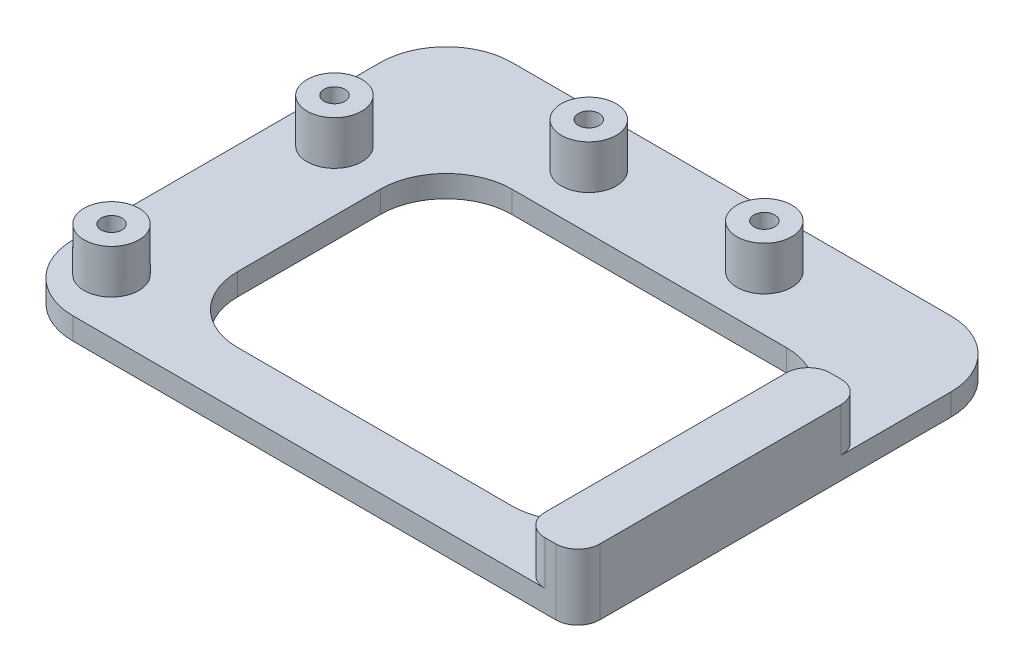
ISO-10303-21;
HEADER;
FILE_DESCRIPTION(('STEP AP214'),'2;1');
FILE_NAME('part.step','',(''),(''),'','','');
FILE_SCHEMA(('AUTOMOTIVE_DESIGN { 1 0 10303 214 1 1 1 1 }'));
ENDSEC;
DATA;
#1=APPLICATION_CONTEXT('core data for automotive mechanical design processes');
#2=APPLICATION_PROTOCOL_DEFINITION('international standard','automotive_design',2000,#1);
#3=PRODUCT_CONTEXT('',#1,'mechanical');
#4=PRODUCT('Part','Part','',(#3));
#5=PRODUCT_RELATED_PRODUCT_CATEGORY('part','',(#4));
#6=PRODUCT_DEFINITION_FORMATION('','',#4);
#7=PRODUCT_DEFINITION_CONTEXT('part definition',#1,'design');
#8=PRODUCT_DEFINITION('design','',#6,#7);
#9=PRODUCT_DEFINITION_SHAPE('','',#8);
#10=(LENGTH_UNIT() NAMED_UNIT(*) SI_UNIT(.MILLI.,.METRE.));
#11=(NAMED_UNIT(*) PLANE_ANGLE_UNIT() SI_UNIT($,.RADIAN.));
#12=(NAMED_UNIT(*) SI_UNIT($,.STERADIAN.) SOLID_ANGLE_UNIT());
#13=UNCERTAINTY_MEASURE_WITH_UNIT(LENGTH_MEASURE(1.E-05),#10,'distance_accuracy_value','');
#14=(GEOMETRIC_REPRESENTATION_CONTEXT(3) GLOBAL_UNCERTAINTY_ASSIGNED_CONTEXT((#13)) GLOBAL_UNIT_ASSIGNED_CONTEXT((#10,
#11,#12)) REPRESENTATION_CONTEXT('',''));
#15=CARTESIAN_POINT('',(0.,0.,0.));
#16=DIRECTION('',(0.,0.,1.));
#17=DIRECTION('',(1.,0.,0.));
#18=AXIS2_PLACEMENT_3D('',#15,#16,#17);
#19=CARTESIAN_POINT('',(0.,2.,0.));
#20=DIRECTION('',(0.,-1.,0.));
#21=DIRECTION('',(0.,0.,-1.));
#22=AXIS2_PLACEMENT_3D('',#19,#20,#21);
#23=PLANE('',#22);
#24=CARTESIAN_POINT('',(-8.,2.,-15.));
#25=DIRECTION('',(0.,-1.,0.));
#26=DIRECTION('',(0.,0.,-1.));
#27=AXIS2_PLACEMENT_3D('',#24,#25,#26);
#28=CIRCLE('',#27,2.5);
#29=CARTESIAN_POINT('',(-8.,2.,-17.5));
#30=VERTEX_POINT('',#29);
#31=EDGE_CURVE('E249',#30,#30,#28,.F.);
#32=ORIENTED_EDGE('',*,*,#31,.F.);
#33=EDGE_LOOP('',(#32));
#34=FACE_BOUND('',#33,.T.);
#35=CARTESIAN_POINT('',(-21.5,2.,15.));
#36=DIRECTION('',(0.,-1.,0.));
#37=DIRECTION('',(0.,0.,-1.));
#38=AXIS2_PLACEMENT_3D('',#35,#36,#37);
#39=CIRCLE('',#38,2.5);
#40=CARTESIAN_POINT('',(-21.5,2.,12.5));
#41=VERTEX_POINT('',#40);
#42=EDGE_CURVE('E241',#41,#41,#39,.F.);
#43=ORIENTED_EDGE('',*,*,#42,.F.);
#44=EDGE_LOOP('',(#43));
#45=FACE_BOUND('',#44,.T.);
#46=CARTESIAN_POINT('',(-21.5,2.,-5.31999999999998));
#47=DIRECTION('',(0.,-1.,0.));
#48=DIRECTION('',(0.,0.,-1.));
#49=AXIS2_PLACEMENT_3D('',#46,#47,#48);
#50=CIRCLE('',#49,2.5);
#51=CARTESIAN_POINT('',(-21.5,2.,-7.81999999999998));
#52=VERTEX_POINT('',#51);
#53=EDGE_CURVE('E237',#52,#52,#50,.F.);
#54=ORIENTED_EDGE('',*,*,#53,.F.);
#55=EDGE_LOOP('',(#54));
#56=FACE_BOUND('',#55,.T.);
#57=CARTESIAN_POINT('',(8.,2.,-15.));
#58=DIRECTION('',(0.,-1.,0.));
#59=DIRECTION('',(0.,0.,-1.));
#60=AXIS2_PLACEMENT_3D('',#57,#58,#59);
#61=CIRCLE('',#60,2.5);
#62=CARTESIAN_POINT('',(8.,2.,-17.5));
#63=VERTEX_POINT('',#62);
#64=EDGE_CURVE('E245',#63,#63,#61,.F.);
#65=ORIENTED_EDGE('',*,*,#64,.F.);
#66=EDGE_LOOP('',(#65));
#67=FACE_BOUND('',#66,.T.);
#68=DIRECTION('',(0.,0.,1.));
#69=VECTOR('',#68,1.);
#70=CARTESIAN_POINT('',(-26.,2.,20.));
#71=LINE('',#70,#69);
#72=CARTESIAN_POINT('',(-26.,2.,-14.));
#73=VERTEX_POINT('',#72);
#74=CARTESIAN_POINT('',(-26.,2.,14.));
#75=VERTEX_POINT('',#74);
#76=EDGE_CURVE('E494',#73,#75,#71,.T.);
#77=ORIENTED_EDGE('',*,*,#76,.T.);
#78=CARTESIAN_POINT('',(-20.,2.,14.));
#79=DIRECTION('',(0.,-1.,0.));
#80=DIRECTION('',(0.,0.,-1.));
#81=AXIS2_PLACEMENT_3D('',#78,#79,#80);
#82=CIRCLE('',#81,6.);
#83=CARTESIAN_POINT('',(-20.,2.,20.));
#84=VERTEX_POINT('',#83);
#85=EDGE_CURVE('E335',#75,#84,#82,.F.);
#86=ORIENTED_EDGE('',*,*,#85,.T.);
#87=DIRECTION('',(1.,0.,0.));
#88=VECTOR('',#87,1.);
#89=CARTESIAN_POINT('',(-26.,2.,20.));
#90=LINE('',#89,#88);
#91=CARTESIAN_POINT('',(23.,2.,20.));
#92=VERTEX_POINT('',#91);
#93=EDGE_CURVE('E227',#84,#92,#90,.T.);
#94=ORIENTED_EDGE('',*,*,#93,.T.);
#95=CARTESIAN_POINT('',(23.,2.,18.));
#96=DIRECTION('',(0.,-1.,0.));
#97=DIRECTION('',(0.,0.,-1.));
#98=AXIS2_PLACEMENT_3D('',#95,#96,#97);
#99=CIRCLE('',#98,2.);
#100=CARTESIAN_POINT('',(21.,2.,18.));
#101=VERTEX_POINT('',#100);
#102=EDGE_CURVE('E286',#92,#101,#99,.T.);
#103=ORIENTED_EDGE('',*,*,#102,.T.);
#104=DIRECTION('',(0.,0.,1.));
#105=VECTOR('',#104,1.);
#106=CARTESIAN_POINT('',(21.,2.,20.));
#107=LINE('',#106,#105);
#108=CARTESIAN_POINT('',(21.,2.,9.));
#109=VERTEX_POINT('',#108);
#110=EDGE_CURVE('E414',#109,#101,#107,.T.);
#111=ORIENTED_EDGE('',*,*,#110,.F.);
#112=CARTESIAN_POINT('',(15.,2.,9.));
#113=DIRECTION('',(0.,-1.,0.));
#114=DIRECTION('',(0.,0.,-1.));
#115=AXIS2_PLACEMENT_3D('',#112,#113,#114);
#116=CIRCLE('',#115,6.);
#117=CARTESIAN_POINT('',(15.,2.,15.));
#118=VERTEX_POINT('',#117);
#119=EDGE_CURVE('E361',#109,#118,#116,.T.);
#120=ORIENTED_EDGE('',*,*,#119,.T.);
#121=DIRECTION('',(1.,0.,0.));
#122=VECTOR('',#121,1.);
#123=CARTESIAN_POINT('',(21.,2.,15.));
#124=LINE('',#123,#122);
#125=CARTESIAN_POINT('',(-10.,2.,15.));
#126=VERTEX_POINT('',#125);
#127=EDGE_CURVE('E423',#126,#118,#124,.T.);
#128=ORIENTED_EDGE('',*,*,#127,.F.);
#129=CARTESIAN_POINT('',(-10.,2.,9.00000000000001));
#130=DIRECTION('',(0.,-1.,0.));
#131=DIRECTION('',(0.,0.,-1.));
#132=AXIS2_PLACEMENT_3D('',#129,#130,#131);
#133=CIRCLE('',#132,6.);
#134=CARTESIAN_POINT('',(-16.,2.,9.00000000000001));
#135=VERTEX_POINT('',#134);
#136=EDGE_CURVE('E55',#126,#135,#133,.T.);
#137=ORIENTED_EDGE('',*,*,#136,.T.);
#138=DIRECTION('',(0.,0.,1.));
#139=VECTOR('',#138,1.);
#140=CARTESIAN_POINT('',(-16.,2.,-10.));
#141=LINE('',#140,#139);
#142=CARTESIAN_POINT('',(-16.,2.,-4.));
#143=VERTEX_POINT('',#142);
#144=EDGE_CURVE('E420',#143,#135,#141,.T.);
#145=ORIENTED_EDGE('',*,*,#144,.F.);
#146=CARTESIAN_POINT('',(-10.,2.,-4.));
#147=DIRECTION('',(0.,-1.,0.));
#148=DIRECTION('',(0.,0.,-1.));
#149=AXIS2_PLACEMENT_3D('',#146,#147,#148);
#150=CIRCLE('',#149,6.);
#151=CARTESIAN_POINT('',(-10.,2.,-10.));
#152=VERTEX_POINT('',#151);
#153=EDGE_CURVE('E63',#143,#152,#150,.T.);
#154=ORIENTED_EDGE('',*,*,#153,.T.);
#155=DIRECTION('',(-1.,0.,0.));
#156=VECTOR('',#155,1.);
#157=CARTESIAN_POINT('',(21.,2.,-10.));
#158=LINE('',#157,#156);
#159=CARTESIAN_POINT('',(15.,2.,-10.));
#160=VERTEX_POINT('',#159);
#161=EDGE_CURVE('E383',#160,#152,#158,.T.);
#162=ORIENTED_EDGE('',*,*,#161,.F.);
#163=CARTESIAN_POINT('',(15.,2.,-4.));
#164=DIRECTION('',(0.,-1.,0.));
#165=DIRECTION('',(0.,0.,-1.));
#166=AXIS2_PLACEMENT_3D('',#163,#164,#165);
#167=CIRCLE('',#166,6.);
#168=CARTESIAN_POINT('',(21.,2.,-4.));
#169=VERTEX_POINT('',#168);
#170=EDGE_CURVE('E48',#160,#169,#167,.T.);
#171=ORIENTED_EDGE('',*,*,#170,.T.);
#172=CARTESIAN_POINT('',(23.,2.,-4.));
#173=DIRECTION('',(0.,-1.,0.));
#174=DIRECTION('',(0.,0.,-1.));
#175=AXIS2_PLACEMENT_3D('',#172,#173,#174);
#176=CIRCLE('',#175,2.);
#177=CARTESIAN_POINT('',(23.,2.,-6.));
#178=VERTEX_POINT('',#177);
#179=EDGE_CURVE('E293',#169,#178,#176,.T.);
#180=ORIENTED_EDGE('',*,*,#179,.T.);
#181=DIRECTION('',(-1.,0.,0.));
#182=VECTOR('',#181,1.);
#183=CARTESIAN_POINT('',(26.,2.,-6.));
#184=LINE('',#183,#182);
#185=CARTESIAN_POINT('',(24.,2.,-6.));
#186=VERTEX_POINT('',#185);
#187=EDGE_CURVE('E410',#186,#178,#184,.T.);
#188=ORIENTED_EDGE('',*,*,#187,.F.);
#189=CARTESIAN_POINT('',(24.,2.,-4.));
#190=DIRECTION('',(0.,-1.,0.));
#191=DIRECTION('',(0.,0.,-1.));
#192=AXIS2_PLACEMENT_3D('',#189,#190,#191);
#193=CIRCLE('',#192,2.);
#194=CARTESIAN_POINT('',(26.,2.,-4.));
#195=VERTEX_POINT('',#194);
#196=EDGE_CURVE('E289',#186,#195,#193,.T.);
#197=ORIENTED_EDGE('',*,*,#196,.T.);
#198=DIRECTION('',(0.,0.,-1.));
#199=VECTOR('',#198,1.);
#200=CARTESIAN_POINT('',(26.,2.,20.));
#201=LINE('',#200,#199);
#202=CARTESIAN_POINT('',(26.,2.,-14.));
#203=VERTEX_POINT('',#202);
#204=EDGE_CURVE('E236',#195,#203,#201,.T.);
#205=ORIENTED_EDGE('',*,*,#204,.T.);
#206=CARTESIAN_POINT('',(20.,2.,-14.));
#207=DIRECTION('',(0.,-1.,0.));
#208=DIRECTION('',(0.,0.,-1.));
#209=AXIS2_PLACEMENT_3D('',#206,#207,#208);
#210=CIRCLE('',#209,6.);
#211=CARTESIAN_POINT('',(20.,2.,-20.));
#212=VERTEX_POINT('',#211);
#213=EDGE_CURVE('E329',#203,#212,#210,.F.);
#214=ORIENTED_EDGE('',*,*,#213,.T.);
#215=DIRECTION('',(-1.,0.,0.));
#216=VECTOR('',#215,1.);
#217=CARTESIAN_POINT('',(-26.,2.,-20.));
#218=LINE('',#217,#216);
#219=CARTESIAN_POINT('',(-20.,2.,-20.));
#220=VERTEX_POINT('',#219);
#221=EDGE_CURVE('E491',#212,#220,#218,.T.);
#222=ORIENTED_EDGE('',*,*,#221,.T.);
#223=CARTESIAN_POINT('',(-20.,2.,-14.));
#224=DIRECTION('',(0.,-1.,0.));
#225=DIRECTION('',(0.,0.,-1.));
#226=AXIS2_PLACEMENT_3D('',#223,#224,#225);
#227=CIRCLE('',#226,6.);
#228=EDGE_CURVE('E332',#220,#73,#227,.F.);
#229=ORIENTED_EDGE('',*,*,#228,.T.);
#230=EDGE_LOOP('',(#77,#86,#94,#103,#111,#120,#128,#137,#145,#154,#162,#171,#180,#188,#197,#205,
#214,#222,#229));
#231=FACE_BOUND('',#230,.T.);
#232=ADVANCED_FACE('F39',(#34,#45,#56,#67,#231),#23,.F.);
#233=CARTESIAN_POINT('',(26.,2.,20.));
#234=DIRECTION('',(-1.,0.,0.));
#235=DIRECTION('',(0.,0.,1.));
#236=AXIS2_PLACEMENT_3D('',#233,#234,#235);
#237=PLANE('',#236);
#238=DIRECTION('',(0.,0.,-1.));
#239=VECTOR('',#238,1.);
#240=CARTESIAN_POINT('',(26.,0.,20.));
#241=LINE('',#240,#239);
#242=CARTESIAN_POINT('',(26.,0.,18.));
#243=VERTEX_POINT('',#242);
#244=CARTESIAN_POINT('',(26.,0.,-14.));
#245=VERTEX_POINT('',#244);
#246=EDGE_CURVE('E204',#243,#245,#241,.T.);
#247=ORIENTED_EDGE('',*,*,#246,.T.);
#248=DIRECTION('',(0.,-1.,0.));
#249=VECTOR('',#248,1.);
#250=CARTESIAN_POINT('',(26.,2.,-14.));
#251=LINE('',#250,#249);
#252=EDGE_CURVE('E358',#245,#203,#251,.F.);
#253=ORIENTED_EDGE('',*,*,#252,.T.);
#254=ORIENTED_EDGE('',*,*,#204,.F.);
#255=DIRECTION('',(0.,-1.,0.));
#256=VECTOR('',#255,1.);
#257=CARTESIAN_POINT('',(26.,2.,-4.));
#258=LINE('',#257,#256);
#259=CARTESIAN_POINT('',(26.,6.,-4.));
#260=VERTEX_POINT('',#259);
#261=EDGE_CURVE('E209',#195,#260,#258,.F.);
#262=ORIENTED_EDGE('',*,*,#261,.T.);
#263=DIRECTION('',(0.,0.,-1.));
#264=VECTOR('',#263,1.);
#265=CARTESIAN_POINT('',(26.,6.,20.));
#266=LINE('',#265,#264);
#267=CARTESIAN_POINT('',(26.,6.,18.));
#268=VERTEX_POINT('',#267);
#269=EDGE_CURVE('E207',#268,#260,#266,.T.);
#270=ORIENTED_EDGE('',*,*,#269,.F.);
#271=DIRECTION('',(0.,-1.,0.));
#272=VECTOR('',#271,1.);
#273=CARTESIAN_POINT('',(26.,2.,18.));
#274=LINE('',#273,#272);
#275=EDGE_CURVE('E192',#268,#243,#274,.T.);
#276=ORIENTED_EDGE('',*,*,#275,.T.);
#277=EDGE_LOOP('',(#247,#253,#254,#262,#270,#276));
#278=FACE_BOUND('',#277,.T.);
#279=ADVANCED_FACE('F203',(#278),#237,.F.);
#280=CARTESIAN_POINT('',(-26.,2.,-20.));
#281=DIRECTION('',(0.,0.,1.));
#282=DIRECTION('',(1.,0.,0.));
#283=AXIS2_PLACEMENT_3D('',#280,#281,#282);
#284=PLANE('',#283);
#285=DIRECTION('',(-1.,0.,0.));
#286=VECTOR('',#285,1.);
#287=CARTESIAN_POINT('',(-26.,0.,-20.));
#288=LINE('',#287,#286);
#289=CARTESIAN_POINT('',(20.,0.,-20.));
#290=VERTEX_POINT('',#289);
#291=CARTESIAN_POINT('',(-20.,0.,-20.));
#292=VERTEX_POINT('',#291);
#293=EDGE_CURVE('E215',#290,#292,#288,.T.);
#294=ORIENTED_EDGE('',*,*,#293,.T.);
#295=DIRECTION('',(0.,-1.,0.));
#296=VECTOR('',#295,1.);
#297=CARTESIAN_POINT('',(-20.,2.,-20.));
#298=LINE('',#297,#296);
#299=EDGE_CURVE('E355',#292,#220,#298,.F.);
#300=ORIENTED_EDGE('',*,*,#299,.T.);
#301=ORIENTED_EDGE('',*,*,#221,.F.);
#302=DIRECTION('',(0.,-1.,0.));
#303=VECTOR('',#302,1.);
#304=CARTESIAN_POINT('',(20.,2.,-20.));
#305=LINE('',#304,#303);
#306=EDGE_CURVE('E351',#212,#290,#305,.T.);
#307=ORIENTED_EDGE('',*,*,#306,.T.);
#308=EDGE_LOOP('',(#294,#300,#301,#307));
#309=FACE_BOUND('',#308,.T.);
#310=ADVANCED_FACE('F526',(#309),#284,.F.);
#311=CARTESIAN_POINT('',(-26.,2.,20.));
#312=DIRECTION('',(1.,0.,0.));
#313=DIRECTION('',(0.,0.,-1.));
#314=AXIS2_PLACEMENT_3D('',#311,#312,#313);
#315=PLANE('',#314);
#316=DIRECTION('',(0.,0.,1.));
#317=VECTOR('',#316,1.);
#318=CARTESIAN_POINT('',(-26.,0.,20.));
#319=LINE('',#318,#317);
#320=CARTESIAN_POINT('',(-26.,0.,-14.));
#321=VERTEX_POINT('',#320);
#322=CARTESIAN_POINT('',(-26.,0.,14.));
#323=VERTEX_POINT('',#322);
#324=EDGE_CURVE('E221',#321,#323,#319,.T.);
#325=ORIENTED_EDGE('',*,*,#324,.T.);
#326=DIRECTION('',(0.,-1.,0.));
#327=VECTOR('',#326,1.);
#328=CARTESIAN_POINT('',(-26.,2.,14.));
#329=LINE('',#328,#327);
#330=EDGE_CURVE('E326',#323,#75,#329,.F.);
#331=ORIENTED_EDGE('',*,*,#330,.T.);
#332=ORIENTED_EDGE('',*,*,#76,.F.);
#333=DIRECTION('',(0.,-1.,0.));
#334=VECTOR('',#333,1.);
#335=CARTESIAN_POINT('',(-26.,2.,-14.));
#336=LINE('',#335,#334);
#337=EDGE_CURVE('E322',#73,#321,#336,.T.);
#338=ORIENTED_EDGE('',*,*,#337,.T.);
#339=EDGE_LOOP('',(#325,#331,#332,#338));
#340=FACE_BOUND('',#339,.T.);
#341=ADVANCED_FACE('F534',(#340),#315,.F.);
#342=CARTESIAN_POINT('',(-26.,2.,20.));
#343=DIRECTION('',(0.,0.,-1.));
#344=DIRECTION('',(-1.,0.,0.));
#345=AXIS2_PLACEMENT_3D('',#342,#343,#344);
#346=PLANE('',#345);
#347=ORIENTED_EDGE('',*,*,#93,.F.);
#348=DIRECTION('',(0.,-1.,0.));
#349=VECTOR('',#348,1.);
#350=CARTESIAN_POINT('',(-20.,2.,20.));
#351=LINE('',#350,#349);
#352=CARTESIAN_POINT('',(-20.,0.,20.));
#353=VERTEX_POINT('',#352);
#354=EDGE_CURVE('E310',#84,#353,#351,.T.);
#355=ORIENTED_EDGE('',*,*,#354,.T.);
#356=DIRECTION('',(1.,0.,0.));
#357=VECTOR('',#356,1.);
#358=CARTESIAN_POINT('',(-26.,0.,20.));
#359=LINE('',#358,#357);
#360=CARTESIAN_POINT('',(24.,0.,20.));
#361=VERTEX_POINT('',#360);
#362=EDGE_CURVE('E233',#353,#361,#359,.T.);
#363=ORIENTED_EDGE('',*,*,#362,.T.);
#364=DIRECTION('',(0.,-1.,0.));
#365=VECTOR('',#364,1.);
#366=CARTESIAN_POINT('',(24.,2.,20.));
#367=LINE('',#366,#365);
#368=CARTESIAN_POINT('',(24.,6.,20.));
#369=VERTEX_POINT('',#368);
#370=EDGE_CURVE('E193',#361,#369,#367,.F.);
#371=ORIENTED_EDGE('',*,*,#370,.T.);
#372=DIRECTION('',(1.,0.,0.));
#373=VECTOR('',#372,1.);
#374=CARTESIAN_POINT('',(26.,6.,20.));
#375=LINE('',#374,#373);
#376=CARTESIAN_POINT('',(23.,6.,20.));
#377=VERTEX_POINT('',#376);
#378=EDGE_CURVE('E432',#377,#369,#375,.T.);
#379=ORIENTED_EDGE('',*,*,#378,.F.);
#380=DIRECTION('',(0.,-1.,0.));
#381=VECTOR('',#380,1.);
#382=CARTESIAN_POINT('',(23.,2.,20.));
#383=LINE('',#382,#381);
#384=EDGE_CURVE('E198',#377,#92,#383,.T.);
#385=ORIENTED_EDGE('',*,*,#384,.T.);
#386=EDGE_LOOP('',(#347,#355,#363,#371,#379,#385));
#387=FACE_BOUND('',#386,.T.);
#388=ADVANCED_FACE('F509',(#387),#346,.F.);
#389=CARTESIAN_POINT('',(0.,0.,0.));
#390=DIRECTION('',(0.,-1.,0.));
#391=DIRECTION('',(0.,0.,-1.));
#392=AXIS2_PLACEMENT_3D('',#389,#390,#391);
#393=PLANE('',#392);
#394=DIRECTION('',(-1.,0.,0.));
#395=VECTOR('',#394,1.);
#396=CARTESIAN_POINT('',(21.,0.,-10.));
#397=LINE('',#396,#395);
#398=CARTESIAN_POINT('',(15.,0.,-10.));
#399=VERTEX_POINT('',#398);
#400=CARTESIAN_POINT('',(-10.,0.,-10.));
#401=VERTEX_POINT('',#400);
#402=EDGE_CURVE('E404',#399,#401,#397,.T.);
#403=ORIENTED_EDGE('',*,*,#402,.T.);
#404=CARTESIAN_POINT('',(-10.,0.,-4.));
#405=DIRECTION('',(0.,-1.,0.));
#406=DIRECTION('',(0.,0.,-1.));
#407=AXIS2_PLACEMENT_3D('',#404,#405,#406);
#408=CIRCLE('',#407,6.);
#409=CARTESIAN_POINT('',(-16.,0.,-4.));
#410=VERTEX_POINT('',#409);
#411=EDGE_CURVE('E374',#401,#410,#408,.F.);
#412=ORIENTED_EDGE('',*,*,#411,.T.);
#413=DIRECTION('',(0.,0.,1.));
#414=VECTOR('',#413,1.);
#415=CARTESIAN_POINT('',(-16.,0.,-10.));
#416=LINE('',#415,#414);
#417=CARTESIAN_POINT('',(-16.,0.,9.00000000000001));
#418=VERTEX_POINT('',#417);
#419=EDGE_CURVE('E429',#410,#418,#416,.T.);
#420=ORIENTED_EDGE('',*,*,#419,.T.);
#421=CARTESIAN_POINT('',(-10.,0.,9.00000000000001));
#422=DIRECTION('',(0.,-1.,0.));
#423=DIRECTION('',(0.,0.,-1.));
#424=AXIS2_PLACEMENT_3D('',#421,#422,#423);
#425=CIRCLE('',#424,6.);
#426=CARTESIAN_POINT('',(-10.,0.,15.));
#427=VERTEX_POINT('',#426);
#428=EDGE_CURVE('E369',#418,#427,#425,.F.);
#429=ORIENTED_EDGE('',*,*,#428,.T.);
#430=DIRECTION('',(1.,0.,0.));
#431=VECTOR('',#430,1.);
#432=CARTESIAN_POINT('',(21.,0.,15.));
#433=LINE('',#432,#431);
#434=CARTESIAN_POINT('',(15.,0.,15.));
#435=VERTEX_POINT('',#434);
#436=EDGE_CURVE('E416',#427,#435,#433,.T.);
#437=ORIENTED_EDGE('',*,*,#436,.T.);
#438=CARTESIAN_POINT('',(15.,0.,9.));
#439=DIRECTION('',(0.,-1.,0.));
#440=DIRECTION('',(0.,0.,-1.));
#441=AXIS2_PLACEMENT_3D('',#438,#439,#440);
#442=CIRCLE('',#441,6.);
#443=CARTESIAN_POINT('',(21.,0.,9.));
#444=VERTEX_POINT('',#443);
#445=EDGE_CURVE('E364',#435,#444,#442,.F.);
#446=ORIENTED_EDGE('',*,*,#445,.T.);
#447=DIRECTION('',(0.,0.,-1.));
#448=VECTOR('',#447,1.);
#449=CARTESIAN_POINT('',(21.,0.,-10.));
#450=LINE('',#449,#448);
#451=CARTESIAN_POINT('',(21.,0.,-4.));
#452=VERTEX_POINT('',#451);
#453=EDGE_CURVE('E406',#444,#452,#450,.T.);
#454=ORIENTED_EDGE('',*,*,#453,.T.);
#455=CARTESIAN_POINT('',(15.,0.,-4.));
#456=DIRECTION('',(0.,-1.,0.));
#457=DIRECTION('',(0.,0.,-1.));
#458=AXIS2_PLACEMENT_3D('',#455,#456,#457);
#459=CIRCLE('',#458,6.);
#460=EDGE_CURVE('E11',#452,#399,#459,.F.);
#461=ORIENTED_EDGE('',*,*,#460,.T.);
#462=EDGE_LOOP('',(#403,#412,#420,#429,#437,#446,#454,#461));
#463=FACE_BOUND('',#462,.T.);
#464=CARTESIAN_POINT('',(8.,0.,-15.));
#465=DIRECTION('',(0.,1.,0.));
#466=DIRECTION('',(0.,0.,1.));
#467=AXIS2_PLACEMENT_3D('',#464,#465,#466);
#468=CIRCLE('',#467,0.949999999999999);
#469=CARTESIAN_POINT('',(8.,0.,-14.05));
#470=VERTEX_POINT('',#469);
#471=EDGE_CURVE('E216',#470,#470,#468,.T.);
#472=ORIENTED_EDGE('',*,*,#471,.T.);
#473=EDGE_LOOP('',(#472));
#474=FACE_BOUND('',#473,.T.);
#475=CARTESIAN_POINT('',(-8.,0.,-15.));
#476=DIRECTION('',(0.,1.,0.));
#477=DIRECTION('',(0.,0.,1.));
#478=AXIS2_PLACEMENT_3D('',#475,#476,#477);
#479=CIRCLE('',#478,0.95);
#480=CARTESIAN_POINT('',(-8.,0.,-14.05));
#481=VERTEX_POINT('',#480);
#482=EDGE_CURVE('E224',#481,#481,#479,.T.);
#483=ORIENTED_EDGE('',*,*,#482,.T.);
#484=EDGE_LOOP('',(#483));
#485=FACE_BOUND('',#484,.T.);
#486=CARTESIAN_POINT('',(-21.5,0.,-5.31999999999998));
#487=DIRECTION('',(0.,1.,0.));
#488=DIRECTION('',(0.,0.,1.));
#489=AXIS2_PLACEMENT_3D('',#486,#487,#488);
#490=CIRCLE('',#489,0.950000000000001);
#491=CARTESIAN_POINT('',(-21.5,0.,-4.36999999999998));
#492=VERTEX_POINT('',#491);
#493=EDGE_CURVE('E481',#492,#492,#490,.T.);
#494=ORIENTED_EDGE('',*,*,#493,.T.);
#495=EDGE_LOOP('',(#494));
#496=FACE_BOUND('',#495,.T.);
#497=CARTESIAN_POINT('',(-21.5,0.,15.));
#498=DIRECTION('',(0.,1.,0.));
#499=DIRECTION('',(0.,0.,1.));
#500=AXIS2_PLACEMENT_3D('',#497,#498,#499);
#501=CIRCLE('',#500,0.950000000000001);
#502=CARTESIAN_POINT('',(-21.5,0.,15.95));
#503=VERTEX_POINT('',#502);
#504=EDGE_CURVE('E476',#503,#503,#501,.T.);
#505=ORIENTED_EDGE('',*,*,#504,.T.);
#506=EDGE_LOOP('',(#505));
#507=FACE_BOUND('',#506,.T.);
#508=ORIENTED_EDGE('',*,*,#362,.F.);
#509=CARTESIAN_POINT('',(-20.,0.,14.));
#510=DIRECTION('',(0.,-1.,0.));
#511=DIRECTION('',(0.,0.,-1.));
#512=AXIS2_PLACEMENT_3D('',#509,#510,#511);
#513=CIRCLE('',#512,6.);
#514=EDGE_CURVE('E319',#353,#323,#513,.T.);
#515=ORIENTED_EDGE('',*,*,#514,.T.);
#516=ORIENTED_EDGE('',*,*,#324,.F.);
#517=CARTESIAN_POINT('',(-20.,0.,-14.));
#518=DIRECTION('',(0.,-1.,0.));
#519=DIRECTION('',(0.,0.,-1.));
#520=AXIS2_PLACEMENT_3D('',#517,#518,#519);
#521=CIRCLE('',#520,6.);
#522=EDGE_CURVE('E316',#321,#292,#521,.T.);
#523=ORIENTED_EDGE('',*,*,#522,.T.);
#524=ORIENTED_EDGE('',*,*,#293,.F.);
#525=CARTESIAN_POINT('',(20.,0.,-14.));
#526=DIRECTION('',(0.,-1.,0.));
#527=DIRECTION('',(0.,0.,-1.));
#528=AXIS2_PLACEMENT_3D('',#525,#526,#527);
#529=CIRCLE('',#528,6.);
#530=EDGE_CURVE('E213',#290,#245,#529,.T.);
#531=ORIENTED_EDGE('',*,*,#530,.T.);
#532=ORIENTED_EDGE('',*,*,#246,.F.);
#533=CARTESIAN_POINT('',(24.,0.,18.));
#534=DIRECTION('',(0.,-1.,0.));
#535=DIRECTION('',(0.,0.,-1.));
#536=AXIS2_PLACEMENT_3D('',#533,#534,#535);
#537=CIRCLE('',#536,2.);
#538=EDGE_CURVE('E188',#243,#361,#537,.T.);
#539=ORIENTED_EDGE('',*,*,#538,.T.);
#540=EDGE_LOOP('',(#508,#515,#516,#523,#524,#531,#532,#539));
#541=FACE_BOUND('',#540,.T.);
#542=ADVANCED_FACE('F211',(#463,#474,#485,#496,#507,#541),#393,.T.);
#543=CARTESIAN_POINT('',(-21.5,0.,15.));
#544=DIRECTION('',(0.,1.,0.));
#545=DIRECTION('',(0.,0.,1.));
#546=AXIS2_PLACEMENT_3D('',#543,#544,#545);
#547=CYLINDRICAL_SURFACE('',#546,0.950000000000001);
#548=ORIENTED_EDGE('',*,*,#504,.F.);
#549=EDGE_LOOP('',(#548));
#550=FACE_BOUND('',#549,.T.);
#551=CARTESIAN_POINT('',(-21.5,6.,15.));
#552=DIRECTION('',(0.,1.,0.));
#553=DIRECTION('',(0.,0.,1.));
#554=AXIS2_PLACEMENT_3D('',#551,#552,#553);
#555=CIRCLE('',#554,0.950000000000001);
#556=CARTESIAN_POINT('',(-21.5,6.,15.95));
#557=VERTEX_POINT('',#556);
#558=EDGE_CURVE('E461',#557,#557,#555,.T.);
#559=ORIENTED_EDGE('',*,*,#558,.T.);
#560=EDGE_LOOP('',(#559));
#561=FACE_BOUND('',#560,.T.);
#562=ADVANCED_FACE('F562',(#550,#561),#547,.F.);
#563=CARTESIAN_POINT('',(-21.5,0.,-5.31999999999998));
#564=DIRECTION('',(0.,1.,0.));
#565=DIRECTION('',(0.,0.,1.));
#566=AXIS2_PLACEMENT_3D('',#563,#564,#565);
#567=CYLINDRICAL_SURFACE('',#566,0.950000000000001);
#568=ORIENTED_EDGE('',*,*,#493,.F.);
#569=EDGE_LOOP('',(#568));
#570=FACE_BOUND('',#569,.T.);
#571=CARTESIAN_POINT('',(-21.5,6.,-5.31999999999998));
#572=DIRECTION('',(0.,1.,0.));
#573=DIRECTION('',(0.,0.,1.));
#574=AXIS2_PLACEMENT_3D('',#571,#572,#573);
#575=CIRCLE('',#574,0.950000000000004);
#576=CARTESIAN_POINT('',(-21.5,6.,-4.36999999999998));
#577=VERTEX_POINT('',#576);
#578=EDGE_CURVE('E469',#577,#577,#575,.T.);
#579=ORIENTED_EDGE('',*,*,#578,.T.);
#580=EDGE_LOOP('',(#579));
#581=FACE_BOUND('',#580,.T.);
#582=ADVANCED_FACE('F702',(#570,#581),#567,.F.);
#583=CARTESIAN_POINT('',(-8.,0.,-15.));
#584=DIRECTION('',(0.,1.,0.));
#585=DIRECTION('',(0.,0.,1.));
#586=AXIS2_PLACEMENT_3D('',#583,#584,#585);
#587=CYLINDRICAL_SURFACE('',#586,0.95);
#588=ORIENTED_EDGE('',*,*,#482,.F.);
#589=EDGE_LOOP('',(#588));
#590=FACE_BOUND('',#589,.T.);
#591=CARTESIAN_POINT('',(-8.,6.,-15.));
#592=DIRECTION('',(0.,1.,0.));
#593=DIRECTION('',(0.,0.,1.));
#594=AXIS2_PLACEMENT_3D('',#591,#592,#593);
#595=CIRCLE('',#594,0.949999999999999);
#596=CARTESIAN_POINT('',(-8.,6.,-14.05));
#597=VERTEX_POINT('',#596);
#598=EDGE_CURVE('E436',#597,#597,#595,.T.);
#599=ORIENTED_EDGE('',*,*,#598,.T.);
#600=EDGE_LOOP('',(#599));
#601=FACE_BOUND('',#600,.T.);
#602=ADVANCED_FACE('F699',(#590,#601),#587,.F.);
#603=CARTESIAN_POINT('',(8.,0.,-15.));
#604=DIRECTION('',(0.,1.,0.));
#605=DIRECTION('',(0.,0.,1.));
#606=AXIS2_PLACEMENT_3D('',#603,#604,#605);
#607=CYLINDRICAL_SURFACE('',#606,0.949999999999999);
#608=ORIENTED_EDGE('',*,*,#471,.F.);
#609=EDGE_LOOP('',(#608));
#610=FACE_BOUND('',#609,.T.);
#611=CARTESIAN_POINT('',(8.,6.,-15.));
#612=DIRECTION('',(0.,1.,0.));
#613=DIRECTION('',(0.,0.,1.));
#614=AXIS2_PLACEMENT_3D('',#611,#612,#613);
#615=CIRCLE('',#614,0.949999999999999);
#616=CARTESIAN_POINT('',(8.,6.,-14.05));
#617=VERTEX_POINT('',#616);
#618=EDGE_CURVE('E453',#617,#617,#615,.T.);
#619=ORIENTED_EDGE('',*,*,#618,.T.);
#620=EDGE_LOOP('',(#619));
#621=FACE_BOUND('',#620,.T.);
#622=ADVANCED_FACE('F692',(#610,#621),#607,.F.);
#623=CARTESIAN_POINT('',(-21.5,6.,-5.31999999999998));
#624=DIRECTION('',(0.,1.,0.));
#625=DIRECTION('',(0.,0.,1.));
#626=AXIS2_PLACEMENT_3D('',#623,#624,#625);
#627=PLANE('',#626);
#628=CARTESIAN_POINT('',(-21.5,6.,-5.31999999999998));
#629=DIRECTION('',(0.,1.,0.));
#630=DIRECTION('',(0.,0.,1.));
#631=AXIS2_PLACEMENT_3D('',#628,#629,#630);
#632=CIRCLE('',#631,2.5);
#633=CARTESIAN_POINT('',(-21.5,6.,-2.81999999999999));
#634=VERTEX_POINT('',#633);
#635=EDGE_CURVE('E473',#634,#634,#632,.T.);
#636=ORIENTED_EDGE('',*,*,#635,.T.);
#637=EDGE_LOOP('',(#636));
#638=FACE_BOUND('',#637,.T.);
#639=ORIENTED_EDGE('',*,*,#578,.F.);
#640=EDGE_LOOP('',(#639));
#641=FACE_BOUND('',#640,.T.);
#642=ADVANCED_FACE('F689',(#638,#641),#627,.T.);
#643=CARTESIAN_POINT('',(-21.5,6.,-5.31999999999998));
#644=DIRECTION('',(0.,-1.,0.));
#645=DIRECTION('',(0.,0.,-1.));
#646=AXIS2_PLACEMENT_3D('',#643,#644,#645);
#647=CYLINDRICAL_SURFACE('',#646,2.5);
#648=ORIENTED_EDGE('',*,*,#635,.F.);
#649=EDGE_LOOP('',(#648));
#650=FACE_BOUND('',#649,.T.);
#651=ORIENTED_EDGE('',*,*,#53,.T.);
#652=EDGE_LOOP('',(#651));
#653=FACE_BOUND('',#652,.T.);
#654=ADVANCED_FACE('F684',(#650,#653),#647,.T.);
#655=CARTESIAN_POINT('',(-21.5,6.,15.));
#656=DIRECTION('',(0.,1.,0.));
#657=DIRECTION('',(0.,0.,1.));
#658=AXIS2_PLACEMENT_3D('',#655,#656,#657);
#659=PLANE('',#658);
#660=CARTESIAN_POINT('',(-21.5,6.,15.));
#661=DIRECTION('',(0.,1.,0.));
#662=DIRECTION('',(0.,0.,1.));
#663=AXIS2_PLACEMENT_3D('',#660,#661,#662);
#664=CIRCLE('',#663,2.5);
#665=CARTESIAN_POINT('',(-21.5,6.,17.5));
#666=VERTEX_POINT('',#665);
#667=EDGE_CURVE('E465',#666,#666,#664,.T.);
#668=ORIENTED_EDGE('',*,*,#667,.T.);
#669=EDGE_LOOP('',(#668));
#670=FACE_BOUND('',#669,.T.);
#671=ORIENTED_EDGE('',*,*,#558,.F.);
#672=EDGE_LOOP('',(#671));
#673=FACE_BOUND('',#672,.T.);
#674=ADVANCED_FACE('F681',(#670,#673),#659,.T.);
#675=CARTESIAN_POINT('',(-21.5,6.,15.));
#676=DIRECTION('',(0.,-1.,0.));
#677=DIRECTION('',(0.,0.,-1.));
#678=AXIS2_PLACEMENT_3D('',#675,#676,#677);
#679=CYLINDRICAL_SURFACE('',#678,2.5);
#680=ORIENTED_EDGE('',*,*,#667,.F.);
#681=EDGE_LOOP('',(#680));
#682=FACE_BOUND('',#681,.T.);
#683=ORIENTED_EDGE('',*,*,#42,.T.);
#684=EDGE_LOOP('',(#683));
#685=FACE_BOUND('',#684,.T.);
#686=ADVANCED_FACE('F676',(#682,#685),#679,.T.);
#687=CARTESIAN_POINT('',(8.,6.,-15.));
#688=DIRECTION('',(0.,1.,0.));
#689=DIRECTION('',(0.,0.,1.));
#690=AXIS2_PLACEMENT_3D('',#687,#688,#689);
#691=PLANE('',#690);
#692=CARTESIAN_POINT('',(8.,6.,-15.));
#693=DIRECTION('',(0.,1.,0.));
#694=DIRECTION('',(0.,0.,1.));
#695=AXIS2_PLACEMENT_3D('',#692,#693,#694);
#696=CIRCLE('',#695,2.5);
#697=CARTESIAN_POINT('',(8.,6.,-12.5));
#698=VERTEX_POINT('',#697);
#699=EDGE_CURVE('E457',#698,#698,#696,.T.);
#700=ORIENTED_EDGE('',*,*,#699,.T.);
#701=EDGE_LOOP('',(#700));
#702=FACE_BOUND('',#701,.T.);
#703=ORIENTED_EDGE('',*,*,#618,.F.);
#704=EDGE_LOOP('',(#703));
#705=FACE_BOUND('',#704,.T.);
#706=ADVANCED_FACE('F673',(#702,#705),#691,.T.);
#707=CARTESIAN_POINT('',(8.,6.,-15.));
#708=DIRECTION('',(0.,-1.,0.));
#709=DIRECTION('',(0.,0.,-1.));
#710=AXIS2_PLACEMENT_3D('',#707,#708,#709);
#711=CYLINDRICAL_SURFACE('',#710,2.5);
#712=ORIENTED_EDGE('',*,*,#699,.F.);
#713=EDGE_LOOP('',(#712));
#714=FACE_BOUND('',#713,.T.);
#715=ORIENTED_EDGE('',*,*,#64,.T.);
#716=EDGE_LOOP('',(#715));
#717=FACE_BOUND('',#716,.T.);
#718=ADVANCED_FACE('F668',(#714,#717),#711,.T.);
#719=CARTESIAN_POINT('',(-8.,6.,-15.));
#720=DIRECTION('',(0.,1.,0.));
#721=DIRECTION('',(0.,0.,1.));
#722=AXIS2_PLACEMENT_3D('',#719,#720,#721);
#723=PLANE('',#722);
#724=CARTESIAN_POINT('',(-8.,6.,-15.));
#725=DIRECTION('',(0.,1.,0.));
#726=DIRECTION('',(0.,0.,1.));
#727=AXIS2_PLACEMENT_3D('',#724,#725,#726);
#728=CIRCLE('',#727,2.5);
#729=CARTESIAN_POINT('',(-8.,6.,-12.5));
#730=VERTEX_POINT('',#729);
#731=EDGE_CURVE('E449',#730,#730,#728,.T.);
#732=ORIENTED_EDGE('',*,*,#731,.T.);
#733=EDGE_LOOP('',(#732));
#734=FACE_BOUND('',#733,.T.);
#735=ORIENTED_EDGE('',*,*,#598,.F.);
#736=EDGE_LOOP('',(#735));
#737=FACE_BOUND('',#736,.T.);
#738=ADVANCED_FACE('F665',(#734,#737),#723,.T.);
#739=CARTESIAN_POINT('',(-8.,6.,-15.));
#740=DIRECTION('',(0.,-1.,0.));
#741=DIRECTION('',(0.,0.,-1.));
#742=AXIS2_PLACEMENT_3D('',#739,#740,#741);
#743=CYLINDRICAL_SURFACE('',#742,2.5);
#744=ORIENTED_EDGE('',*,*,#731,.F.);
#745=EDGE_LOOP('',(#744));
#746=FACE_BOUND('',#745,.T.);
#747=ORIENTED_EDGE('',*,*,#31,.T.);
#748=EDGE_LOOP('',(#747));
#749=FACE_BOUND('',#748,.T.);
#750=ADVANCED_FACE('F662',(#746,#749),#743,.T.);
#751=CARTESIAN_POINT('',(26.,32.4764045897475,-6.));
#752=DIRECTION('',(0.,0.,1.));
#753=DIRECTION('',(1.,0.,0.));
#754=AXIS2_PLACEMENT_3D('',#751,#752,#753);
#755=PLANE('',#754);
#756=DIRECTION('',(-1.,0.,0.));
#757=VECTOR('',#756,1.);
#758=CARTESIAN_POINT('',(26.,6.,-6.));
#759=LINE('',#758,#757);
#760=CARTESIAN_POINT('',(24.,6.,-6.));
#761=VERTEX_POINT('',#760);
#762=CARTESIAN_POINT('',(23.,6.,-6.));
#763=VERTEX_POINT('',#762);
#764=EDGE_CURVE('E437',#761,#763,#759,.T.);
#765=ORIENTED_EDGE('',*,*,#764,.F.);
#766=DIRECTION('',(0.,-1.,0.));
#767=VECTOR('',#766,1.);
#768=CARTESIAN_POINT('',(24.,32.4764045897475,-6.));
#769=LINE('',#768,#767);
#770=EDGE_CURVE('E282',#761,#186,#769,.T.);
#771=ORIENTED_EDGE('',*,*,#770,.T.);
#772=ORIENTED_EDGE('',*,*,#187,.T.);
#773=DIRECTION('',(0.,-1.,0.));
#774=VECTOR('',#773,1.);
#775=CARTESIAN_POINT('',(23.,32.4764045897475,-6.));
#776=LINE('',#775,#774);
#777=EDGE_CURVE('E279',#178,#763,#776,.F.);
#778=ORIENTED_EDGE('',*,*,#777,.T.);
#779=EDGE_LOOP('',(#765,#771,#772,#778));
#780=FACE_BOUND('',#779,.T.);
#781=ADVANCED_FACE('F516',(#780),#755,.F.);
#782=CARTESIAN_POINT('',(21.,32.4764045897475,20.));
#783=DIRECTION('',(1.,0.,0.));
#784=DIRECTION('',(0.,0.,-1.));
#785=AXIS2_PLACEMENT_3D('',#782,#783,#784);
#786=PLANE('',#785);
#787=ORIENTED_EDGE('',*,*,#453,.F.);
#788=DIRECTION('',(0.,1.,0.));
#789=VECTOR('',#788,1.);
#790=CARTESIAN_POINT('',(21.,2.,9.));
#791=LINE('',#790,#789);
#792=EDGE_CURVE('E299',#444,#109,#791,.T.);
#793=ORIENTED_EDGE('',*,*,#792,.T.);
#794=ORIENTED_EDGE('',*,*,#110,.T.);
#795=DIRECTION('',(0.,-1.,0.));
#796=VECTOR('',#795,1.);
#797=CARTESIAN_POINT('',(21.,32.4764045897475,18.));
#798=LINE('',#797,#796);
#799=CARTESIAN_POINT('',(21.,6.,18.));
#800=VERTEX_POINT('',#799);
#801=EDGE_CURVE('E276',#101,#800,#798,.F.);
#802=ORIENTED_EDGE('',*,*,#801,.T.);
#803=DIRECTION('',(0.,0.,1.));
#804=VECTOR('',#803,1.);
#805=CARTESIAN_POINT('',(21.,6.,20.));
#806=LINE('',#805,#804);
#807=CARTESIAN_POINT('',(21.,6.,-4.));
#808=VERTEX_POINT('',#807);
#809=EDGE_CURVE('E398',#808,#800,#806,.T.);
#810=ORIENTED_EDGE('',*,*,#809,.F.);
#811=DIRECTION('',(0.,-1.,0.));
#812=VECTOR('',#811,1.);
#813=CARTESIAN_POINT('',(21.,32.4764045897475,-4.));
#814=LINE('',#813,#812);
#815=EDGE_CURVE('E272',#808,#169,#814,.T.);
#816=ORIENTED_EDGE('',*,*,#815,.T.);
#817=DIRECTION('',(0.,1.,0.));
#818=VECTOR('',#817,1.);
#819=CARTESIAN_POINT('',(21.,0.,-4.));
#820=LINE('',#819,#818);
#821=EDGE_CURVE('E296',#169,#452,#820,.F.);
#822=ORIENTED_EDGE('',*,*,#821,.T.);
#823=EDGE_LOOP('',(#787,#793,#794,#802,#810,#816,#822));
#824=FACE_BOUND('',#823,.T.);
#825=ADVANCED_FACE('F395',(#824),#786,.F.);
#826=CARTESIAN_POINT('',(-21.5,6.,-5.31999999999998));
#827=DIRECTION('',(0.,1.,0.));
#828=DIRECTION('',(0.,0.,1.));
#829=AXIS2_PLACEMENT_3D('',#826,#827,#828);
#830=PLANE('',#829);
#831=ORIENTED_EDGE('',*,*,#378,.T.);
#832=CARTESIAN_POINT('',(24.,6.,18.));
#833=DIRECTION('',(0.,1.,0.));
#834=DIRECTION('',(0.,0.,1.));
#835=AXIS2_PLACEMENT_3D('',#832,#833,#834);
#836=CIRCLE('',#835,2.);
#837=EDGE_CURVE('E269',#369,#268,#836,.T.);
#838=ORIENTED_EDGE('',*,*,#837,.T.);
#839=ORIENTED_EDGE('',*,*,#269,.T.);
#840=CARTESIAN_POINT('',(24.,6.,-4.));
#841=DIRECTION('',(0.,1.,0.));
#842=DIRECTION('',(0.,0.,1.));
#843=AXIS2_PLACEMENT_3D('',#840,#841,#842);
#844=CIRCLE('',#843,2.);
#845=EDGE_CURVE('E263',#260,#761,#844,.T.);
#846=ORIENTED_EDGE('',*,*,#845,.T.);
#847=ORIENTED_EDGE('',*,*,#764,.T.);
#848=CARTESIAN_POINT('',(23.,6.,-4.));
#849=DIRECTION('',(0.,1.,0.));
#850=DIRECTION('',(0.,0.,1.));
#851=AXIS2_PLACEMENT_3D('',#848,#849,#850);
#852=CIRCLE('',#851,2.);
#853=EDGE_CURVE('E260',#763,#808,#852,.T.);
#854=ORIENTED_EDGE('',*,*,#853,.T.);
#855=ORIENTED_EDGE('',*,*,#809,.T.);
#856=CARTESIAN_POINT('',(23.,6.,18.));
#857=DIRECTION('',(0.,1.,0.));
#858=DIRECTION('',(0.,0.,1.));
#859=AXIS2_PLACEMENT_3D('',#856,#857,#858);
#860=CIRCLE('',#859,2.);
#861=EDGE_CURVE('E266',#800,#377,#860,.T.);
#862=ORIENTED_EDGE('',*,*,#861,.T.);
#863=EDGE_LOOP('',(#831,#838,#839,#846,#847,#854,#855,#862));
#864=FACE_BOUND('',#863,.T.);
#865=ADVANCED_FACE('F511',(#864),#830,.T.);
#866=CARTESIAN_POINT('',(-16.,0.,-10.));
#867=DIRECTION('',(-1.,0.,0.));
#868=DIRECTION('',(0.,0.,1.));
#869=AXIS2_PLACEMENT_3D('',#866,#867,#868);
#870=PLANE('',#869);
#871=ORIENTED_EDGE('',*,*,#144,.T.);
#872=DIRECTION('',(0.,1.,0.));
#873=VECTOR('',#872,1.);
#874=CARTESIAN_POINT('',(-16.,0.,9.00000000000001));
#875=LINE('',#874,#873);
#876=EDGE_CURVE('E341',#135,#418,#875,.F.);
#877=ORIENTED_EDGE('',*,*,#876,.T.);
#878=ORIENTED_EDGE('',*,*,#419,.F.);
#879=DIRECTION('',(0.,1.,0.));
#880=VECTOR('',#879,1.);
#881=CARTESIAN_POINT('',(-16.,2.,-4.));
#882=LINE('',#881,#880);
#883=EDGE_CURVE('E338',#410,#143,#882,.T.);
#884=ORIENTED_EDGE('',*,*,#883,.T.);
#885=EDGE_LOOP('',(#871,#877,#878,#884));
#886=FACE_BOUND('',#885,.T.);
#887=ADVANCED_FACE('F637',(#886),#870,.F.);
#888=CARTESIAN_POINT('',(21.,0.,-10.));
#889=DIRECTION('',(0.,0.,-1.));
#890=DIRECTION('',(-1.,0.,0.));
#891=AXIS2_PLACEMENT_3D('',#888,#889,#890);
#892=PLANE('',#891);
#893=ORIENTED_EDGE('',*,*,#161,.T.);
#894=DIRECTION('',(0.,1.,0.));
#895=VECTOR('',#894,1.);
#896=CARTESIAN_POINT('',(-10.,0.,-10.));
#897=LINE('',#896,#895);
#898=EDGE_CURVE('E348',#152,#401,#897,.F.);
#899=ORIENTED_EDGE('',*,*,#898,.T.);
#900=ORIENTED_EDGE('',*,*,#402,.F.);
#901=DIRECTION('',(0.,1.,0.));
#902=VECTOR('',#901,1.);
#903=CARTESIAN_POINT('',(15.,2.,-10.));
#904=LINE('',#903,#902);
#905=EDGE_CURVE('E344',#399,#160,#904,.T.);
#906=ORIENTED_EDGE('',*,*,#905,.T.);
#907=EDGE_LOOP('',(#893,#899,#900,#906));
#908=FACE_BOUND('',#907,.T.);
#909=ADVANCED_FACE('F408',(#908),#892,.F.);
#910=CARTESIAN_POINT('',(21.,0.,15.));
#911=DIRECTION('',(0.,0.,1.));
#912=DIRECTION('',(1.,0.,0.));
#913=AXIS2_PLACEMENT_3D('',#910,#911,#912);
#914=PLANE('',#913);
#915=ORIENTED_EDGE('',*,*,#127,.T.);
#916=DIRECTION('',(0.,1.,0.));
#917=VECTOR('',#916,1.);
#918=CARTESIAN_POINT('',(15.,0.,15.));
#919=LINE('',#918,#917);
#920=EDGE_CURVE('E307',#118,#435,#919,.F.);
#921=ORIENTED_EDGE('',*,*,#920,.T.);
#922=ORIENTED_EDGE('',*,*,#436,.F.);
#923=DIRECTION('',(0.,1.,0.));
#924=VECTOR('',#923,1.);
#925=CARTESIAN_POINT('',(-10.,2.,15.));
#926=LINE('',#925,#924);
#927=EDGE_CURVE('E303',#427,#126,#926,.T.);
#928=ORIENTED_EDGE('',*,*,#927,.T.);
#929=EDGE_LOOP('',(#915,#921,#922,#928));
#930=FACE_BOUND('',#929,.T.);
#931=ADVANCED_FACE('F574',(#930),#914,.F.);
#932=CARTESIAN_POINT('',(24.,2.,18.));
#933=DIRECTION('',(0.,-1.,0.));
#934=DIRECTION('',(0.,0.,-1.));
#935=AXIS2_PLACEMENT_3D('',#932,#933,#934);
#936=CYLINDRICAL_SURFACE('',#935,2.);
#937=ORIENTED_EDGE('',*,*,#837,.F.);
#938=ORIENTED_EDGE('',*,*,#370,.F.);
#939=ORIENTED_EDGE('',*,*,#538,.F.);
#940=ORIENTED_EDGE('',*,*,#275,.F.);
#941=EDGE_LOOP('',(#937,#938,#939,#940));
#942=FACE_BOUND('',#941,.T.);
#943=ADVANCED_FACE('F191',(#942),#936,.T.);
#944=CARTESIAN_POINT('',(23.,2.,18.));
#945=DIRECTION('',(0.,-1.,0.));
#946=DIRECTION('',(0.,0.,-1.));
#947=AXIS2_PLACEMENT_3D('',#944,#945,#946);
#948=CYLINDRICAL_SURFACE('',#947,2.);
#949=ORIENTED_EDGE('',*,*,#861,.F.);
#950=ORIENTED_EDGE('',*,*,#801,.F.);
#951=ORIENTED_EDGE('',*,*,#102,.F.);
#952=ORIENTED_EDGE('',*,*,#384,.F.);
#953=EDGE_LOOP('',(#949,#950,#951,#952));
#954=FACE_BOUND('',#953,.T.);
#955=ADVANCED_FACE('F507',(#954),#948,.T.);
#956=CARTESIAN_POINT('',(24.,32.4764045897475,-4.));
#957=DIRECTION('',(0.,-1.,0.));
#958=DIRECTION('',(0.,0.,-1.));
#959=AXIS2_PLACEMENT_3D('',#956,#957,#958);
#960=CYLINDRICAL_SURFACE('',#959,2.);
#961=ORIENTED_EDGE('',*,*,#845,.F.);
#962=ORIENTED_EDGE('',*,*,#261,.F.);
#963=ORIENTED_EDGE('',*,*,#196,.F.);
#964=ORIENTED_EDGE('',*,*,#770,.F.);
#965=EDGE_LOOP('',(#961,#962,#963,#964));
#966=FACE_BOUND('',#965,.T.);
#967=ADVANCED_FACE('F518',(#966),#960,.T.);
#968=CARTESIAN_POINT('',(23.,32.4764045897475,-4.));
#969=DIRECTION('',(0.,-1.,0.));
#970=DIRECTION('',(0.,0.,-1.));
#971=AXIS2_PLACEMENT_3D('',#968,#969,#970);
#972=CYLINDRICAL_SURFACE('',#971,2.);
#973=ORIENTED_EDGE('',*,*,#853,.F.);
#974=ORIENTED_EDGE('',*,*,#777,.F.);
#975=ORIENTED_EDGE('',*,*,#179,.F.);
#976=ORIENTED_EDGE('',*,*,#815,.F.);
#977=EDGE_LOOP('',(#973,#974,#975,#976));
#978=FACE_BOUND('',#977,.T.);
#979=ADVANCED_FACE('F391',(#978),#972,.T.);
#980=CARTESIAN_POINT('',(15.,32.4764045897475,9.));
#981=DIRECTION('',(0.,-1.,0.));
#982=DIRECTION('',(0.,0.,-1.));
#983=AXIS2_PLACEMENT_3D('',#980,#981,#982);
#984=CYLINDRICAL_SURFACE('',#983,6.);
#985=ORIENTED_EDGE('',*,*,#445,.F.);
#986=ORIENTED_EDGE('',*,*,#920,.F.);
#987=ORIENTED_EDGE('',*,*,#119,.F.);
#988=ORIENTED_EDGE('',*,*,#792,.F.);
#989=EDGE_LOOP('',(#985,#986,#987,#988));
#990=FACE_BOUND('',#989,.T.);
#991=ADVANCED_FACE('F540',(#990),#984,.F.);
#992=CARTESIAN_POINT('',(-20.,2.,14.));
#993=DIRECTION('',(0.,-1.,0.));
#994=DIRECTION('',(0.,0.,-1.));
#995=AXIS2_PLACEMENT_3D('',#992,#993,#994);
#996=CYLINDRICAL_SURFACE('',#995,6.);
#997=ORIENTED_EDGE('',*,*,#85,.F.);
#998=ORIENTED_EDGE('',*,*,#330,.F.);
#999=ORIENTED_EDGE('',*,*,#514,.F.);
#1000=ORIENTED_EDGE('',*,*,#354,.F.);
#1001=EDGE_LOOP('',(#997,#998,#999,#1000));
#1002=FACE_BOUND('',#1001,.T.);
#1003=ADVANCED_FACE('F537',(#1002),#996,.T.);
#1004=CARTESIAN_POINT('',(-10.,0.,9.00000000000001));
#1005=DIRECTION('',(0.,-1.,0.));
#1006=DIRECTION('',(0.,0.,-1.));
#1007=AXIS2_PLACEMENT_3D('',#1004,#1005,#1006);
#1008=CYLINDRICAL_SURFACE('',#1007,6.);
#1009=ORIENTED_EDGE('',*,*,#428,.F.);
#1010=ORIENTED_EDGE('',*,*,#876,.F.);
#1011=ORIENTED_EDGE('',*,*,#136,.F.);
#1012=ORIENTED_EDGE('',*,*,#927,.F.);
#1013=EDGE_LOOP('',(#1009,#1010,#1011,#1012));
#1014=FACE_BOUND('',#1013,.T.);
#1015=ADVANCED_FACE('F539',(#1014),#1008,.F.);
#1016=CARTESIAN_POINT('',(-10.,0.,-4.));
#1017=DIRECTION('',(0.,-1.,0.));
#1018=DIRECTION('',(0.,0.,-1.));
#1019=AXIS2_PLACEMENT_3D('',#1016,#1017,#1018);
#1020=CYLINDRICAL_SURFACE('',#1019,6.);
#1021=ORIENTED_EDGE('',*,*,#411,.F.);
#1022=ORIENTED_EDGE('',*,*,#898,.F.);
#1023=ORIENTED_EDGE('',*,*,#153,.F.);
#1024=ORIENTED_EDGE('',*,*,#883,.F.);
#1025=EDGE_LOOP('',(#1021,#1022,#1023,#1024));
#1026=FACE_BOUND('',#1025,.T.);
#1027=ADVANCED_FACE('F546',(#1026),#1020,.F.);
#1028=CARTESIAN_POINT('',(-20.,2.,-14.));
#1029=DIRECTION('',(0.,-1.,0.));
#1030=DIRECTION('',(0.,0.,-1.));
#1031=AXIS2_PLACEMENT_3D('',#1028,#1029,#1030);
#1032=CYLINDRICAL_SURFACE('',#1031,6.);
#1033=ORIENTED_EDGE('',*,*,#228,.F.);
#1034=ORIENTED_EDGE('',*,*,#299,.F.);
#1035=ORIENTED_EDGE('',*,*,#522,.F.);
#1036=ORIENTED_EDGE('',*,*,#337,.F.);
#1037=EDGE_LOOP('',(#1033,#1034,#1035,#1036));
#1038=FACE_BOUND('',#1037,.T.);
#1039=ADVANCED_FACE('F532',(#1038),#1032,.T.);
#1040=CARTESIAN_POINT('',(20.,2.,-14.));
#1041=DIRECTION('',(0.,-1.,0.));
#1042=DIRECTION('',(0.,0.,-1.));
#1043=AXIS2_PLACEMENT_3D('',#1040,#1041,#1042);
#1044=CYLINDRICAL_SURFACE('',#1043,6.);
#1045=ORIENTED_EDGE('',*,*,#213,.F.);
#1046=ORIENTED_EDGE('',*,*,#252,.F.);
#1047=ORIENTED_EDGE('',*,*,#530,.F.);
#1048=ORIENTED_EDGE('',*,*,#306,.F.);
#1049=EDGE_LOOP('',(#1045,#1046,#1047,#1048));
#1050=FACE_BOUND('',#1049,.T.);
#1051=ADVANCED_FACE('F524',(#1050),#1044,.T.);
#1052=CARTESIAN_POINT('',(15.,0.,-4.));
#1053=DIRECTION('',(0.,-1.,0.));
#1054=DIRECTION('',(0.,0.,-1.));
#1055=AXIS2_PLACEMENT_3D('',#1052,#1053,#1054);
#1056=CYLINDRICAL_SURFACE('',#1055,6.);
#1057=ORIENTED_EDGE('',*,*,#460,.F.);
#1058=ORIENTED_EDGE('',*,*,#821,.F.);
#1059=ORIENTED_EDGE('',*,*,#170,.F.);
#1060=ORIENTED_EDGE('',*,*,#905,.F.);
#1061=EDGE_LOOP('',(#1057,#1058,#1059,#1060));
#1062=FACE_BOUND('',#1061,.T.);
#1063=ADVANCED_FACE('F41',(#1062),#1056,.F.);
#1064=CLOSED_SHELL('',(#232,#279,#310,#341,#388,#542,#562,#582,#602,#622,#642,#654,#674,#686,
#706,#718,#738,#750,#781,#825,#865,#887,#909,#931,#943,#955,#967,#979,#991,#1003,#1015,#1027,
#1039,#1051,#1063));
#1065=MANIFOLD_SOLID_BREP('B2',#1064);
#1066=ADVANCED_BREP_SHAPE_REPRESENTATION('',(#18,#1065),#14);
#1067=SHAPE_DEFINITION_REPRESENTATION(#9,#1066);
ENDSEC;
END-ISO-10303-21;
